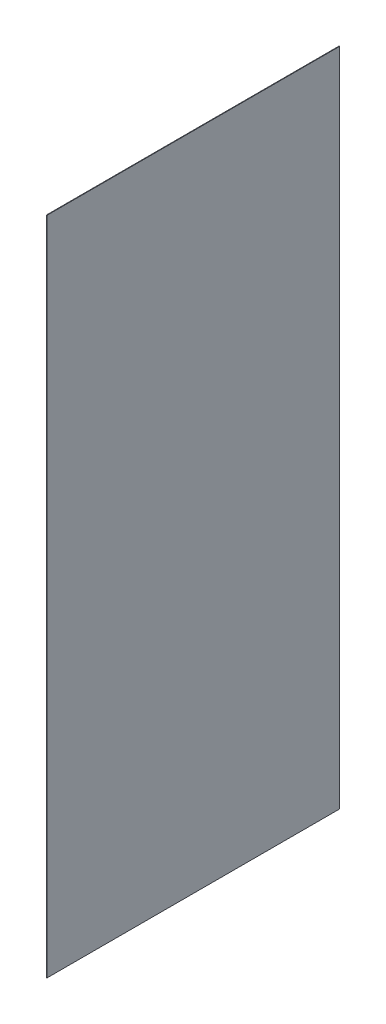
ISO-10303-21;
HEADER;
FILE_DESCRIPTION(('STEP AP214'),'2;1');
FILE_NAME('part.step','',(''),(''),'','','');
FILE_SCHEMA(('AUTOMOTIVE_DESIGN { 1 0 10303 214 1 1 1 1 }'));
ENDSEC;
DATA;
#1=APPLICATION_CONTEXT('core data for automotive mechanical design processes');
#2=APPLICATION_PROTOCOL_DEFINITION('international standard','automotive_design',2000,#1);
#3=PRODUCT_CONTEXT('',#1,'mechanical');
#4=PRODUCT('Part','Part','',(#3));
#5=PRODUCT_RELATED_PRODUCT_CATEGORY('part','',(#4));
#6=PRODUCT_DEFINITION_FORMATION('','',#4);
#7=PRODUCT_DEFINITION_CONTEXT('part definition',#1,'design');
#8=PRODUCT_DEFINITION('design','',#6,#7);
#9=PRODUCT_DEFINITION_SHAPE('','',#8);
#10=(LENGTH_UNIT() NAMED_UNIT(*) SI_UNIT(.MILLI.,.METRE.));
#11=(NAMED_UNIT(*) PLANE_ANGLE_UNIT() SI_UNIT($,.RADIAN.));
#12=(NAMED_UNIT(*) SI_UNIT($,.STERADIAN.) SOLID_ANGLE_UNIT());
#13=UNCERTAINTY_MEASURE_WITH_UNIT(LENGTH_MEASURE(1.E-05),#10,'distance_accuracy_value','');
#14=(GEOMETRIC_REPRESENTATION_CONTEXT(3) GLOBAL_UNCERTAINTY_ASSIGNED_CONTEXT((#13)) GLOBAL_UNIT_ASSIGNED_CONTEXT((#10,
#11,#12)) REPRESENTATION_CONTEXT('',''));
#15=CARTESIAN_POINT('',(0.,0.,0.));
#16=DIRECTION('',(0.,0.,1.));
#17=DIRECTION('',(1.,0.,0.));
#18=AXIS2_PLACEMENT_3D('',#15,#16,#17);
#19=CARTESIAN_POINT('',(0.,120.,-820.));
#20=DIRECTION('',(-1.,0.,0.));
#21=DIRECTION('',(0.,0.,1.));
#22=AXIS2_PLACEMENT_3D('',#19,#20,#21);
#23=PLANE('',#22);
#24=DIRECTION('',(0.,-1.,0.));
#25=VECTOR('',#24,1.);
#26=CARTESIAN_POINT('',(0.,120.,0.));
#27=LINE('',#26,#25);
#28=CARTESIAN_POINT('',(0.,1970.,0.));
#29=VERTEX_POINT('',#28);
#30=CARTESIAN_POINT('',(0.,120.,0.));
#31=VERTEX_POINT('',#30);
#32=EDGE_CURVE('E103',#29,#31,#27,.T.);
#33=ORIENTED_EDGE('',*,*,#32,.F.);
#34=DIRECTION('',(0.,0.,1.));
#35=VECTOR('',#34,1.);
#36=CARTESIAN_POINT('',(0.,1970.,-820.));
#37=LINE('',#36,#35);
#38=CARTESIAN_POINT('',(0.,1970.,-820.));
#39=VERTEX_POINT('',#38);
#40=EDGE_CURVE('E11',#39,#29,#37,.T.);
#41=ORIENTED_EDGE('',*,*,#40,.F.);
#42=DIRECTION('',(0.,-1.,0.));
#43=VECTOR('',#42,1.);
#44=CARTESIAN_POINT('',(0.,120.,-820.));
#45=LINE('',#44,#43);
#46=CARTESIAN_POINT('',(0.,120.,-820.));
#47=VERTEX_POINT('',#46);
#48=EDGE_CURVE('E97',#39,#47,#45,.T.);
#49=ORIENTED_EDGE('',*,*,#48,.T.);
#50=DIRECTION('',(0.,0.,1.));
#51=VECTOR('',#50,1.);
#52=CARTESIAN_POINT('',(0.,120.,-820.));
#53=LINE('',#52,#51);
#54=EDGE_CURVE('E42',#47,#31,#53,.T.);
#55=ORIENTED_EDGE('',*,*,#54,.T.);
#56=EDGE_LOOP('',(#33,#41,#49,#55));
#57=FACE_BOUND('',#56,.T.);
#58=ADVANCED_FACE('F39',(#57),#23,.T.);
#59=CARTESIAN_POINT('',(0.,1970.,-820.));
#60=DIRECTION('',(0.,1.,0.));
#61=DIRECTION('',(0.,0.,1.));
#62=AXIS2_PLACEMENT_3D('',#59,#60,#61);
#63=PLANE('',#62);
#64=DIRECTION('',(-1.,0.,0.));
#65=VECTOR('',#64,1.);
#66=CARTESIAN_POINT('',(0.,1970.,0.));
#67=LINE('',#66,#65);
#68=CARTESIAN_POINT('',(1.5,1970.,0.));
#69=VERTEX_POINT('',#68);
#70=EDGE_CURVE('E99',#69,#29,#67,.T.);
#71=ORIENTED_EDGE('',*,*,#70,.F.);
#72=DIRECTION('',(0.,0.,1.));
#73=VECTOR('',#72,1.);
#74=CARTESIAN_POINT('',(1.5,1970.,-820.));
#75=LINE('',#74,#73);
#76=CARTESIAN_POINT('',(1.5,1970.,-820.));
#77=VERTEX_POINT('',#76);
#78=EDGE_CURVE('E48',#77,#69,#75,.T.);
#79=ORIENTED_EDGE('',*,*,#78,.F.);
#80=DIRECTION('',(-1.,0.,0.));
#81=VECTOR('',#80,1.);
#82=CARTESIAN_POINT('',(0.,1970.,-820.));
#83=LINE('',#82,#81);
#84=EDGE_CURVE('E94',#77,#39,#83,.T.);
#85=ORIENTED_EDGE('',*,*,#84,.T.);
#86=ORIENTED_EDGE('',*,*,#40,.T.);
#87=EDGE_LOOP('',(#71,#79,#85,#86));
#88=FACE_BOUND('',#87,.T.);
#89=ADVANCED_FACE('F113',(#88),#63,.T.);
#90=CARTESIAN_POINT('',(1.5,120.,-820.));
#91=DIRECTION('',(1.,0.,0.));
#92=DIRECTION('',(0.,0.,-1.));
#93=AXIS2_PLACEMENT_3D('',#90,#91,#92);
#94=PLANE('',#93);
#95=DIRECTION('',(0.,1.,0.));
#96=VECTOR('',#95,1.);
#97=CARTESIAN_POINT('',(1.5,120.,0.));
#98=LINE('',#97,#96);
#99=CARTESIAN_POINT('',(1.5,120.,0.));
#100=VERTEX_POINT('',#99);
#101=EDGE_CURVE('E89',#100,#69,#98,.T.);
#102=ORIENTED_EDGE('',*,*,#101,.F.);
#103=DIRECTION('',(0.,0.,1.));
#104=VECTOR('',#103,1.);
#105=CARTESIAN_POINT('',(1.5,120.,-820.));
#106=LINE('',#105,#104);
#107=CARTESIAN_POINT('',(1.5,120.,-820.));
#108=VERTEX_POINT('',#107);
#109=EDGE_CURVE('E84',#108,#100,#106,.T.);
#110=ORIENTED_EDGE('',*,*,#109,.F.);
#111=DIRECTION('',(0.,1.,0.));
#112=VECTOR('',#111,1.);
#113=CARTESIAN_POINT('',(1.5,120.,-820.));
#114=LINE('',#113,#112);
#115=EDGE_CURVE('E87',#108,#77,#114,.T.);
#116=ORIENTED_EDGE('',*,*,#115,.T.);
#117=ORIENTED_EDGE('',*,*,#78,.T.);
#118=EDGE_LOOP('',(#102,#110,#116,#117));
#119=FACE_BOUND('',#118,.T.);
#120=ADVANCED_FACE('F86',(#119),#94,.T.);
#121=CARTESIAN_POINT('',(0.,120.,-820.));
#122=DIRECTION('',(0.,-1.,0.));
#123=DIRECTION('',(0.,0.,-1.));
#124=AXIS2_PLACEMENT_3D('',#121,#122,#123);
#125=PLANE('',#124);
#126=DIRECTION('',(1.,0.,0.));
#127=VECTOR('',#126,1.);
#128=CARTESIAN_POINT('',(0.,120.,0.));
#129=LINE('',#128,#127);
#130=EDGE_CURVE('E106',#31,#100,#129,.T.);
#131=ORIENTED_EDGE('',*,*,#130,.F.);
#132=ORIENTED_EDGE('',*,*,#54,.F.);
#133=DIRECTION('',(1.,0.,0.));
#134=VECTOR('',#133,1.);
#135=CARTESIAN_POINT('',(0.,120.,-820.));
#136=LINE('',#135,#134);
#137=EDGE_CURVE('E93',#47,#108,#136,.T.);
#138=ORIENTED_EDGE('',*,*,#137,.T.);
#139=ORIENTED_EDGE('',*,*,#109,.T.);
#140=EDGE_LOOP('',(#131,#132,#138,#139));
#141=FACE_BOUND('',#140,.T.);
#142=ADVANCED_FACE('F96',(#141),#125,.T.);
#143=CARTESIAN_POINT('',(0.,0.,-820.));
#144=DIRECTION('',(0.,0.,-1.));
#145=DIRECTION('',(-1.,0.,0.));
#146=AXIS2_PLACEMENT_3D('',#143,#144,#145);
#147=PLANE('',#146);
#148=ORIENTED_EDGE('',*,*,#48,.F.);
#149=ORIENTED_EDGE('',*,*,#84,.F.);
#150=ORIENTED_EDGE('',*,*,#115,.F.);
#151=ORIENTED_EDGE('',*,*,#137,.F.);
#152=EDGE_LOOP('',(#148,#149,#150,#151));
#153=FACE_BOUND('',#152,.T.);
#154=ADVANCED_FACE('F92',(#153),#147,.T.);
#155=CARTESIAN_POINT('',(0.,0.,0.));
#156=DIRECTION('',(0.,0.,-1.));
#157=DIRECTION('',(-1.,0.,0.));
#158=AXIS2_PLACEMENT_3D('',#155,#156,#157);
#159=PLANE('',#158);
#160=ORIENTED_EDGE('',*,*,#32,.T.);
#161=ORIENTED_EDGE('',*,*,#130,.T.);
#162=ORIENTED_EDGE('',*,*,#101,.T.);
#163=ORIENTED_EDGE('',*,*,#70,.T.);
#164=EDGE_LOOP('',(#160,#161,#162,#163));
#165=FACE_BOUND('',#164,.T.);
#166=ADVANCED_FACE('F112',(#165),#159,.F.);
#167=CLOSED_SHELL('',(#58,#89,#120,#142,#154,#166));
#168=MANIFOLD_SOLID_BREP('B2',#167);
#169=ADVANCED_BREP_SHAPE_REPRESENTATION('',(#18,#168),#14);
#170=SHAPE_DEFINITION_REPRESENTATION(#9,#169);
ENDSEC;
END-ISO-10303-21;
